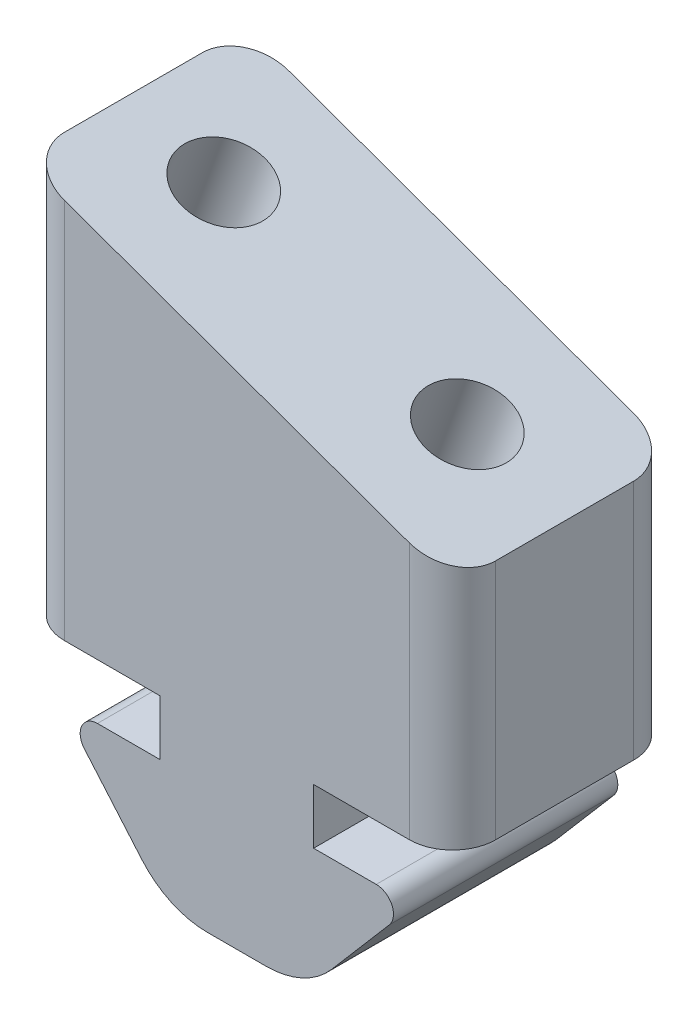
ISO-10303-21;
HEADER;
FILE_DESCRIPTION(('STEP AP214'),'2;1');
FILE_NAME('part.step','',(''),(''),'','','');
FILE_SCHEMA(('AUTOMOTIVE_DESIGN { 1 0 10303 214 1 1 1 1 }'));
ENDSEC;
DATA;
#1=APPLICATION_CONTEXT('core data for automotive mechanical design processes');
#2=APPLICATION_PROTOCOL_DEFINITION('international standard','automotive_design',2000,#1);
#3=PRODUCT_CONTEXT('',#1,'mechanical');
#4=PRODUCT('Part','Part','',(#3));
#5=PRODUCT_RELATED_PRODUCT_CATEGORY('part','',(#4));
#6=PRODUCT_DEFINITION_FORMATION('','',#4);
#7=PRODUCT_DEFINITION_CONTEXT('part definition',#1,'design');
#8=PRODUCT_DEFINITION('design','',#6,#7);
#9=PRODUCT_DEFINITION_SHAPE('','',#8);
#10=(LENGTH_UNIT() NAMED_UNIT(*) SI_UNIT(.MILLI.,.METRE.));
#11=(NAMED_UNIT(*) PLANE_ANGLE_UNIT() SI_UNIT($,.RADIAN.));
#12=(NAMED_UNIT(*) SI_UNIT($,.STERADIAN.) SOLID_ANGLE_UNIT());
#13=UNCERTAINTY_MEASURE_WITH_UNIT(LENGTH_MEASURE(1.E-05),#10,'distance_accuracy_value','');
#14=(GEOMETRIC_REPRESENTATION_CONTEXT(3) GLOBAL_UNCERTAINTY_ASSIGNED_CONTEXT((#13)) GLOBAL_UNIT_ASSIGNED_CONTEXT((#10,
#11,#12)) REPRESENTATION_CONTEXT('',''));
#15=CARTESIAN_POINT('',(0.,0.,0.));
#16=DIRECTION('',(0.,0.,1.));
#17=DIRECTION('',(1.,0.,0.));
#18=AXIS2_PLACEMENT_3D('',#15,#16,#17);
#19=CARTESIAN_POINT('',(12.5,0.,13.));
#20=DIRECTION('',(1.,0.,0.));
#21=DIRECTION('',(0.,1.,0.));
#22=AXIS2_PLACEMENT_3D('',#19,#20,#21);
#23=PLANE('',#22);
#24=DIRECTION('',(0.,0.,-1.));
#25=VECTOR('',#24,1.);
#26=CARTESIAN_POINT('',(12.5,10.5,13.));
#27=LINE('',#26,#25);
#28=CARTESIAN_POINT('',(12.5,10.5,10.5));
#29=VERTEX_POINT('',#28);
#30=CARTESIAN_POINT('',(12.5,10.5,2.5));
#31=VERTEX_POINT('',#30);
#32=EDGE_CURVE('E244',#29,#31,#27,.T.);
#33=ORIENTED_EDGE('',*,*,#32,.T.);
#34=DIRECTION('',(0.,-1.,0.));
#35=VECTOR('',#34,1.);
#36=CARTESIAN_POINT('',(12.5,24.5,2.5));
#37=LINE('',#36,#35);
#38=CARTESIAN_POINT('',(12.5,24.5,2.5));
#39=VERTEX_POINT('',#38);
#40=EDGE_CURVE('E325',#31,#39,#37,.F.);
#41=ORIENTED_EDGE('',*,*,#40,.T.);
#42=DIRECTION('',(0.,0.,-1.));
#43=VECTOR('',#42,1.);
#44=CARTESIAN_POINT('',(12.5,24.5,13.));
#45=LINE('',#44,#43);
#46=CARTESIAN_POINT('',(12.5,24.5,10.5));
#47=VERTEX_POINT('',#46);
#48=EDGE_CURVE('E257',#47,#39,#45,.T.);
#49=ORIENTED_EDGE('',*,*,#48,.F.);
#50=DIRECTION('',(0.,-1.,0.));
#51=VECTOR('',#50,1.);
#52=CARTESIAN_POINT('',(12.5,0.,10.5));
#53=LINE('',#52,#51);
#54=EDGE_CURVE('E322',#47,#29,#53,.T.);
#55=ORIENTED_EDGE('',*,*,#54,.T.);
#56=EDGE_LOOP('',(#33,#41,#49,#55));
#57=FACE_BOUND('',#56,.T.);
#58=ADVANCED_FACE('F41',(#57),#23,.T.);
#59=CARTESIAN_POINT('',(9.24220963172805,25.6728045325779,13.));
#60=DIRECTION('',(0.338719468272742,0.940887411868727,0.));
#61=DIRECTION('',(-0.940887411868727,0.338719468272742,0.));
#62=AXIS2_PLACEMENT_3D('',#59,#60,#61);
#63=PLANE('',#62);
#64=CARTESIAN_POINT('',(-7.25863564924326,31.6131088337276,6.5));
#65=DIRECTION('',(0.338719468272742,0.940887411868727,0.));
#66=DIRECTION('',(-0.940887411868727,0.338719468272742,0.));
#67=AXIS2_PLACEMENT_3D('',#64,#65,#66);
#68=CIRCLE('',#67,2.4);
#69=CARTESIAN_POINT('',(-9.51676543772821,32.4260355575822,6.5));
#70=VERTEX_POINT('',#69);
#71=EDGE_CURVE('E621',#70,#70,#68,.T.);
#72=ORIENTED_EDGE('',*,*,#71,.F.);
#73=EDGE_LOOP('',(#72));
#74=FACE_BOUND('',#73,.T.);
#75=CARTESIAN_POINT('',(6.85467552878764,26.5323168096365,6.5));
#76=DIRECTION('',(0.338719468272742,0.940887411868727,0.));
#77=DIRECTION('',(-0.940887411868727,0.338719468272742,0.));
#78=AXIS2_PLACEMENT_3D('',#75,#76,#77);
#79=CIRCLE('',#78,2.4);
#80=CARTESIAN_POINT('',(4.59654574030269,27.345243533491,6.5));
#81=VERTEX_POINT('',#80);
#82=EDGE_CURVE('E624',#81,#81,#79,.T.);
#83=ORIENTED_EDGE('',*,*,#82,.F.);
#84=EDGE_LOOP('',(#83));
#85=FACE_BOUND('',#84,.T.);
#86=DIRECTION('',(0.940887411868727,-0.338719468272742,0.));
#87=VECTOR('',#86,1.);
#88=CARTESIAN_POINT('',(9.24220963172805,25.6728045325779,0.));
#89=LINE('',#88,#87);
#90=CARTESIAN_POINT('',(-10.,32.6,0.));
#91=VERTEX_POINT('',#90);
#92=CARTESIAN_POINT('',(10.,25.4,0.));
#93=VERTEX_POINT('',#92);
#94=EDGE_CURVE('E221',#91,#93,#89,.T.);
#95=ORIENTED_EDGE('',*,*,#94,.F.);
#96=CARTESIAN_POINT('',(-10.,32.6,2.5));
#97=DIRECTION('',(0.338719468272742,0.940887411868727,0.));
#98=DIRECTION('',(0.940887411868727,-0.338719468272742,0.));
#99=AXIS2_PLACEMENT_3D('',#96,#97,#98);
#100=ELLIPSE('',#99,2.65706605111728,2.5);
#101=CARTESIAN_POINT('',(-12.5,33.5,2.5));
#102=VERTEX_POINT('',#101);
#103=EDGE_CURVE('E318',#91,#102,#100,.T.);
#104=ORIENTED_EDGE('',*,*,#103,.T.);
#105=DIRECTION('',(0.,0.,-1.));
#106=VECTOR('',#105,1.);
#107=CARTESIAN_POINT('',(-12.5,33.5,13.));
#108=LINE('',#107,#106);
#109=CARTESIAN_POINT('',(-12.5,33.5,10.5));
#110=VERTEX_POINT('',#109);
#111=EDGE_CURVE('E254',#110,#102,#108,.T.);
#112=ORIENTED_EDGE('',*,*,#111,.F.);
#113=CARTESIAN_POINT('',(-10.,32.6,10.5));
#114=DIRECTION('',(0.338719468272742,0.940887411868727,0.));
#115=DIRECTION('',(-0.940887411868727,0.338719468272742,0.));
#116=AXIS2_PLACEMENT_3D('',#113,#114,#115);
#117=ELLIPSE('',#116,2.65706605111728,2.5);
#118=CARTESIAN_POINT('',(-10.,32.6,13.));
#119=VERTEX_POINT('',#118);
#120=EDGE_CURVE('E314',#110,#119,#117,.T.);
#121=ORIENTED_EDGE('',*,*,#120,.T.);
#122=DIRECTION('',(0.940887411868727,-0.338719468272742,0.));
#123=VECTOR('',#122,1.);
#124=CARTESIAN_POINT('',(9.24220963172805,25.6728045325779,13.));
#125=LINE('',#124,#123);
#126=CARTESIAN_POINT('',(10.,25.4,13.));
#127=VERTEX_POINT('',#126);
#128=EDGE_CURVE('E187',#119,#127,#125,.T.);
#129=ORIENTED_EDGE('',*,*,#128,.T.);
#130=CARTESIAN_POINT('',(10.,25.4,10.5));
#131=DIRECTION('',(0.338719468272742,0.940887411868727,0.));
#132=DIRECTION('',(0.940887411868727,-0.338719468272742,0.));
#133=AXIS2_PLACEMENT_3D('',#130,#131,#132);
#134=ELLIPSE('',#133,2.65706605111728,2.5);
#135=EDGE_CURVE('E312',#127,#47,#134,.T.);
#136=ORIENTED_EDGE('',*,*,#135,.T.);
#137=ORIENTED_EDGE('',*,*,#48,.T.);
#138=CARTESIAN_POINT('',(10.,25.4,2.5));
#139=DIRECTION('',(0.338719468272742,0.940887411868727,0.));
#140=DIRECTION('',(-0.940887411868727,0.338719468272742,0.));
#141=AXIS2_PLACEMENT_3D('',#138,#139,#140);
#142=ELLIPSE('',#141,2.65706605111728,2.5);
#143=EDGE_CURVE('E316',#39,#93,#142,.T.);
#144=ORIENTED_EDGE('',*,*,#143,.T.);
#145=EDGE_LOOP('',(#95,#104,#112,#121,#129,#136,#137,#144));
#146=FACE_BOUND('',#145,.T.);
#147=ADVANCED_FACE('F332',(#74,#85,#146),#63,.T.);
#148=CARTESIAN_POINT('',(-12.5,0.,13.));
#149=DIRECTION('',(1.,0.,0.));
#150=DIRECTION('',(0.,0.,-1.));
#151=AXIS2_PLACEMENT_3D('',#148,#149,#150);
#152=PLANE('',#151);
#153=ORIENTED_EDGE('',*,*,#111,.T.);
#154=DIRECTION('',(0.,-1.,0.));
#155=VECTOR('',#154,1.);
#156=CARTESIAN_POINT('',(-12.5,0.,2.5));
#157=LINE('',#156,#155);
#158=CARTESIAN_POINT('',(-12.5,10.5,2.5));
#159=VERTEX_POINT('',#158);
#160=EDGE_CURVE('E300',#102,#159,#157,.T.);
#161=ORIENTED_EDGE('',*,*,#160,.T.);
#162=DIRECTION('',(0.,0.,-1.));
#163=VECTOR('',#162,1.);
#164=CARTESIAN_POINT('',(-12.5,10.5,13.));
#165=LINE('',#164,#163);
#166=CARTESIAN_POINT('',(-12.5,10.5,10.5));
#167=VERTEX_POINT('',#166);
#168=EDGE_CURVE('E198',#167,#159,#165,.T.);
#169=ORIENTED_EDGE('',*,*,#168,.F.);
#170=DIRECTION('',(0.,-1.,0.));
#171=VECTOR('',#170,1.);
#172=CARTESIAN_POINT('',(-12.5,33.5,10.5));
#173=LINE('',#172,#171);
#174=EDGE_CURVE('E298',#167,#110,#173,.F.);
#175=ORIENTED_EDGE('',*,*,#174,.T.);
#176=EDGE_LOOP('',(#153,#161,#169,#175));
#177=FACE_BOUND('',#176,.T.);
#178=ADVANCED_FACE('F355',(#177),#152,.F.);
#179=CARTESIAN_POINT('',(0.,10.5,13.));
#180=DIRECTION('',(0.,1.,0.));
#181=DIRECTION('',(-1.,0.,0.));
#182=AXIS2_PLACEMENT_3D('',#179,#180,#181);
#183=PLANE('',#182);
#184=ORIENTED_EDGE('',*,*,#168,.T.);
#185=CARTESIAN_POINT('',(-10.,10.5,2.5));
#186=DIRECTION('',(0.,1.,0.));
#187=DIRECTION('',(-1.,0.,0.));
#188=AXIS2_PLACEMENT_3D('',#185,#186,#187);
#189=CIRCLE('',#188,2.5);
#190=CARTESIAN_POINT('',(-10.,10.5,0.));
#191=VERTEX_POINT('',#190);
#192=EDGE_CURVE('E305',#159,#191,#189,.F.);
#193=ORIENTED_EDGE('',*,*,#192,.T.);
#194=DIRECTION('',(1.,0.,0.));
#195=VECTOR('',#194,1.);
#196=CARTESIAN_POINT('',(0.,10.5,0.));
#197=LINE('',#196,#195);
#198=CARTESIAN_POINT('',(-4.45,10.5,0.));
#199=VERTEX_POINT('',#198);
#200=EDGE_CURVE('E195',#191,#199,#197,.T.);
#201=ORIENTED_EDGE('',*,*,#200,.T.);
#202=DIRECTION('',(0.,0.,-1.));
#203=VECTOR('',#202,1.);
#204=CARTESIAN_POINT('',(-4.45,10.5,13.));
#205=LINE('',#204,#203);
#206=CARTESIAN_POINT('',(-4.45,10.5,13.));
#207=VERTEX_POINT('',#206);
#208=EDGE_CURVE('E191',#207,#199,#205,.T.);
#209=ORIENTED_EDGE('',*,*,#208,.F.);
#210=DIRECTION('',(1.,0.,0.));
#211=VECTOR('',#210,1.);
#212=CARTESIAN_POINT('',(0.,10.5,13.));
#213=LINE('',#212,#211);
#214=CARTESIAN_POINT('',(-10.,10.5,13.));
#215=VERTEX_POINT('',#214);
#216=EDGE_CURVE('E177',#215,#207,#213,.T.);
#217=ORIENTED_EDGE('',*,*,#216,.F.);
#218=CARTESIAN_POINT('',(-10.,10.5,10.5));
#219=DIRECTION('',(0.,1.,0.));
#220=DIRECTION('',(-1.,0.,0.));
#221=AXIS2_PLACEMENT_3D('',#218,#219,#220);
#222=CIRCLE('',#221,2.5);
#223=EDGE_CURVE('E303',#215,#167,#222,.F.);
#224=ORIENTED_EDGE('',*,*,#223,.T.);
#225=EDGE_LOOP('',(#184,#193,#201,#209,#217,#224));
#226=FACE_BOUND('',#225,.T.);
#227=ADVANCED_FACE('F193',(#226),#183,.F.);
#228=CARTESIAN_POINT('',(-4.45,0.,13.));
#229=DIRECTION('',(1.,0.,0.));
#230=DIRECTION('',(0.,1.,0.));
#231=AXIS2_PLACEMENT_3D('',#228,#229,#230);
#232=PLANE('',#231);
#233=DIRECTION('',(0.,-1.,0.));
#234=VECTOR('',#233,1.);
#235=CARTESIAN_POINT('',(-4.45,0.,0.));
#236=LINE('',#235,#234);
#237=CARTESIAN_POINT('',(-4.45,7.3,0.));
#238=VERTEX_POINT('',#237);
#239=EDGE_CURVE('E226',#199,#238,#236,.T.);
#240=ORIENTED_EDGE('',*,*,#239,.T.);
#241=DIRECTION('',(0.,0.,-1.));
#242=VECTOR('',#241,1.);
#243=CARTESIAN_POINT('',(-4.45,7.3,13.));
#244=LINE('',#243,#242);
#245=CARTESIAN_POINT('',(-4.45,7.3,13.));
#246=VERTEX_POINT('',#245);
#247=EDGE_CURVE('E199',#246,#238,#244,.T.);
#248=ORIENTED_EDGE('',*,*,#247,.F.);
#249=DIRECTION('',(0.,-1.,0.));
#250=VECTOR('',#249,1.);
#251=CARTESIAN_POINT('',(-4.45,0.,13.));
#252=LINE('',#251,#250);
#253=EDGE_CURVE('E183',#207,#246,#252,.T.);
#254=ORIENTED_EDGE('',*,*,#253,.F.);
#255=ORIENTED_EDGE('',*,*,#208,.T.);
#256=EDGE_LOOP('',(#240,#248,#254,#255));
#257=FACE_BOUND('',#256,.T.);
#258=ADVANCED_FACE('F201',(#257),#232,.F.);
#259=CARTESIAN_POINT('',(0.,7.3,13.));
#260=DIRECTION('',(0.,-1.,0.));
#261=DIRECTION('',(1.,0.,0.));
#262=AXIS2_PLACEMENT_3D('',#259,#260,#261);
#263=PLANE('',#262);
#264=DIRECTION('',(-1.,0.,0.));
#265=VECTOR('',#264,1.);
#266=CARTESIAN_POINT('',(0.,7.3,0.));
#267=LINE('',#266,#265);
#268=CARTESIAN_POINT('',(-8.07739440936548,7.3,0.));
#269=VERTEX_POINT('',#268);
#270=EDGE_CURVE('E229',#238,#269,#267,.T.);
#271=ORIENTED_EDGE('',*,*,#270,.T.);
#272=DIRECTION('',(0.,0.,-1.));
#273=VECTOR('',#272,1.);
#274=CARTESIAN_POINT('',(-8.07739440936548,7.3,13.));
#275=LINE('',#274,#273);
#276=CARTESIAN_POINT('',(-8.07739440936548,7.3,13.));
#277=VERTEX_POINT('',#276);
#278=EDGE_CURVE('E278',#269,#277,#275,.F.);
#279=ORIENTED_EDGE('',*,*,#278,.T.);
#280=DIRECTION('',(-1.,0.,0.));
#281=VECTOR('',#280,1.);
#282=CARTESIAN_POINT('',(0.,7.3,13.));
#283=LINE('',#282,#281);
#284=EDGE_CURVE('E204',#246,#277,#283,.T.);
#285=ORIENTED_EDGE('',*,*,#284,.F.);
#286=ORIENTED_EDGE('',*,*,#247,.T.);
#287=EDGE_LOOP('',(#271,#279,#285,#286));
#288=FACE_BOUND('',#287,.T.);
#289=ADVANCED_FACE('F406',(#288),#263,.F.);
#290=CARTESIAN_POINT('',(-2.30811293684524,-1.97612408976476,13.));
#291=DIRECTION('',(0.759623745160267,0.650362795513927,0.));
#292=DIRECTION('',(-0.650362795513927,0.759623745160267,0.));
#293=AXIS2_PLACEMENT_3D('',#290,#291,#292);
#294=PLANE('',#293);
#295=DIRECTION('',(0.650362795513927,-0.759623745160267,0.));
#296=VECTOR('',#295,1.);
#297=CARTESIAN_POINT('',(-2.30811293684524,-1.97612408976476,0.));
#298=LINE('',#297,#296);
#299=CARTESIAN_POINT('',(-8.83701815452575,5.64963720448607,0.));
#300=VERTEX_POINT('',#299);
#301=CARTESIAN_POINT('',(-5.49673460824518,1.74818602243036,0.));
#302=VERTEX_POINT('',#301);
#303=EDGE_CURVE('E232',#300,#302,#298,.T.);
#304=ORIENTED_EDGE('',*,*,#303,.T.);
#305=DIRECTION('',(0.,0.,-1.));
#306=VECTOR('',#305,1.);
#307=CARTESIAN_POINT('',(-5.49673460824518,1.74818602243036,13.));
#308=LINE('',#307,#306);
#309=CARTESIAN_POINT('',(-5.49673460824518,1.74818602243036,13.));
#310=VERTEX_POINT('',#309);
#311=EDGE_CURVE('E296',#302,#310,#308,.F.);
#312=ORIENTED_EDGE('',*,*,#311,.T.);
#313=DIRECTION('',(0.650362795513927,-0.759623745160267,0.));
#314=VECTOR('',#313,1.);
#315=CARTESIAN_POINT('',(-2.30811293684524,-1.97612408976476,13.));
#316=LINE('',#315,#314);
#317=CARTESIAN_POINT('',(-8.83701815452575,5.64963720448607,13.));
#318=VERTEX_POINT('',#317);
#319=EDGE_CURVE('E206',#318,#310,#316,.T.);
#320=ORIENTED_EDGE('',*,*,#319,.F.);
#321=DIRECTION('',(0.,0.,-1.));
#322=VECTOR('',#321,1.);
#323=CARTESIAN_POINT('',(-8.83701815452575,5.64963720448607,13.));
#324=LINE('',#323,#322);
#325=EDGE_CURVE('E275',#318,#300,#324,.T.);
#326=ORIENTED_EDGE('',*,*,#325,.T.);
#327=EDGE_LOOP('',(#304,#312,#320,#326));
#328=FACE_BOUND('',#327,.T.);
#329=ADVANCED_FACE('F413',(#328),#294,.F.);
#330=CARTESIAN_POINT('',(0.,0.,13.));
#331=DIRECTION('',(0.,1.,0.));
#332=DIRECTION('',(0.,0.,1.));
#333=AXIS2_PLACEMENT_3D('',#330,#331,#332);
#334=PLANE('',#333);
#335=DIRECTION('',(1.,0.,0.));
#336=VECTOR('',#335,1.);
#337=CARTESIAN_POINT('',(0.,0.,0.));
#338=LINE('',#337,#336);
#339=CARTESIAN_POINT('',(-1.69861588244384,0.,0.));
#340=VERTEX_POINT('',#339);
#341=CARTESIAN_POINT('',(1.69861588244384,0.,0.));
#342=VERTEX_POINT('',#341);
#343=EDGE_CURVE('E235',#340,#342,#338,.T.);
#344=ORIENTED_EDGE('',*,*,#343,.T.);
#345=DIRECTION('',(0.,0.,-1.));
#346=VECTOR('',#345,1.);
#347=CARTESIAN_POINT('',(1.69861588244384,0.,13.));
#348=LINE('',#347,#346);
#349=CARTESIAN_POINT('',(1.69861588244384,0.,13.));
#350=VERTEX_POINT('',#349);
#351=EDGE_CURVE('E290',#342,#350,#348,.F.);
#352=ORIENTED_EDGE('',*,*,#351,.T.);
#353=DIRECTION('',(1.,0.,0.));
#354=VECTOR('',#353,1.);
#355=CARTESIAN_POINT('',(0.,0.,13.));
#356=LINE('',#355,#354);
#357=CARTESIAN_POINT('',(-1.69861588244384,0.,13.));
#358=VERTEX_POINT('',#357);
#359=EDGE_CURVE('E212',#358,#350,#356,.T.);
#360=ORIENTED_EDGE('',*,*,#359,.F.);
#361=DIRECTION('',(0.,0.,-1.));
#362=VECTOR('',#361,1.);
#363=CARTESIAN_POINT('',(-1.69861588244384,0.,13.));
#364=LINE('',#363,#362);
#365=EDGE_CURVE('E287',#358,#340,#364,.T.);
#366=ORIENTED_EDGE('',*,*,#365,.T.);
#367=EDGE_LOOP('',(#344,#352,#360,#366));
#368=FACE_BOUND('',#367,.T.);
#369=ADVANCED_FACE('F420',(#368),#334,.F.);
#370=CARTESIAN_POINT('',(2.30811293684524,-1.97612408976476,13.));
#371=DIRECTION('',(-0.759623745160267,0.650362795513927,0.));
#372=DIRECTION('',(-0.650362795513927,-0.759623745160267,0.));
#373=AXIS2_PLACEMENT_3D('',#370,#371,#372);
#374=PLANE('',#373);
#375=DIRECTION('',(0.650362795513927,0.759623745160267,0.));
#376=VECTOR('',#375,1.);
#377=CARTESIAN_POINT('',(2.30811293684524,-1.97612408976476,13.));
#378=LINE('',#377,#376);
#379=CARTESIAN_POINT('',(5.49673460824518,1.74818602243037,13.));
#380=VERTEX_POINT('',#379);
#381=CARTESIAN_POINT('',(8.83701815452575,5.64963720448607,13.));
#382=VERTEX_POINT('',#381);
#383=EDGE_CURVE('E215',#380,#382,#378,.T.);
#384=ORIENTED_EDGE('',*,*,#383,.F.);
#385=DIRECTION('',(0.,0.,-1.));
#386=VECTOR('',#385,1.);
#387=CARTESIAN_POINT('',(5.49673460824518,1.74818602243036,13.));
#388=LINE('',#387,#386);
#389=CARTESIAN_POINT('',(5.49673460824518,1.74818602243037,0.));
#390=VERTEX_POINT('',#389);
#391=EDGE_CURVE('E280',#380,#390,#388,.T.);
#392=ORIENTED_EDGE('',*,*,#391,.T.);
#393=DIRECTION('',(0.650362795513927,0.759623745160267,0.));
#394=VECTOR('',#393,1.);
#395=CARTESIAN_POINT('',(2.30811293684524,-1.97612408976476,0.));
#396=LINE('',#395,#394);
#397=CARTESIAN_POINT('',(8.83701815452575,5.64963720448607,0.));
#398=VERTEX_POINT('',#397);
#399=EDGE_CURVE('E238',#390,#398,#396,.T.);
#400=ORIENTED_EDGE('',*,*,#399,.T.);
#401=DIRECTION('',(0.,0.,-1.));
#402=VECTOR('',#401,1.);
#403=CARTESIAN_POINT('',(8.83701815452575,5.64963720448607,13.));
#404=LINE('',#403,#402);
#405=EDGE_CURVE('E268',#398,#382,#404,.F.);
#406=ORIENTED_EDGE('',*,*,#405,.T.);
#407=EDGE_LOOP('',(#384,#392,#400,#406));
#408=FACE_BOUND('',#407,.T.);
#409=ADVANCED_FACE('F427',(#408),#374,.F.);
#410=CARTESIAN_POINT('',(0.,7.3,13.));
#411=DIRECTION('',(0.,-1.,0.));
#412=DIRECTION('',(1.,0.,0.));
#413=AXIS2_PLACEMENT_3D('',#410,#411,#412);
#414=PLANE('',#413);
#415=DIRECTION('',(-1.,0.,0.));
#416=VECTOR('',#415,1.);
#417=CARTESIAN_POINT('',(0.,7.3,13.));
#418=LINE('',#417,#416);
#419=CARTESIAN_POINT('',(8.07739440936548,7.3,13.));
#420=VERTEX_POINT('',#419);
#421=CARTESIAN_POINT('',(4.45,7.3,13.));
#422=VERTEX_POINT('',#421);
#423=EDGE_CURVE('E217',#420,#422,#418,.T.);
#424=ORIENTED_EDGE('',*,*,#423,.F.);
#425=DIRECTION('',(0.,0.,-1.));
#426=VECTOR('',#425,1.);
#427=CARTESIAN_POINT('',(8.07739440936548,7.3,13.));
#428=LINE('',#427,#426);
#429=CARTESIAN_POINT('',(8.07739440936548,7.3,0.));
#430=VERTEX_POINT('',#429);
#431=EDGE_CURVE('E260',#420,#430,#428,.T.);
#432=ORIENTED_EDGE('',*,*,#431,.T.);
#433=DIRECTION('',(-1.,0.,0.));
#434=VECTOR('',#433,1.);
#435=CARTESIAN_POINT('',(0.,7.3,0.));
#436=LINE('',#435,#434);
#437=CARTESIAN_POINT('',(4.45,7.3,0.));
#438=VERTEX_POINT('',#437);
#439=EDGE_CURVE('E240',#430,#438,#436,.T.);
#440=ORIENTED_EDGE('',*,*,#439,.T.);
#441=DIRECTION('',(0.,0.,-1.));
#442=VECTOR('',#441,1.);
#443=CARTESIAN_POINT('',(4.45,7.3,13.));
#444=LINE('',#443,#442);
#445=EDGE_CURVE('E249',#422,#438,#444,.T.);
#446=ORIENTED_EDGE('',*,*,#445,.F.);
#447=EDGE_LOOP('',(#424,#432,#440,#446));
#448=FACE_BOUND('',#447,.T.);
#449=ADVANCED_FACE('F351',(#448),#414,.F.);
#450=CARTESIAN_POINT('',(4.45,0.,13.));
#451=DIRECTION('',(-1.,0.,0.));
#452=DIRECTION('',(0.,-1.,0.));
#453=AXIS2_PLACEMENT_3D('',#450,#451,#452);
#454=PLANE('',#453);
#455=DIRECTION('',(0.,1.,0.));
#456=VECTOR('',#455,1.);
#457=CARTESIAN_POINT('',(4.45,0.,0.));
#458=LINE('',#457,#456);
#459=CARTESIAN_POINT('',(4.45,10.5,0.));
#460=VERTEX_POINT('',#459);
#461=EDGE_CURVE('E242',#438,#460,#458,.T.);
#462=ORIENTED_EDGE('',*,*,#461,.T.);
#463=DIRECTION('',(0.,0.,-1.));
#464=VECTOR('',#463,1.);
#465=CARTESIAN_POINT('',(4.45,10.5,13.));
#466=LINE('',#465,#464);
#467=CARTESIAN_POINT('',(4.45,10.5,13.));
#468=VERTEX_POINT('',#467);
#469=EDGE_CURVE('E246',#468,#460,#466,.T.);
#470=ORIENTED_EDGE('',*,*,#469,.F.);
#471=DIRECTION('',(0.,1.,0.));
#472=VECTOR('',#471,1.);
#473=CARTESIAN_POINT('',(4.45,0.,13.));
#474=LINE('',#473,#472);
#475=EDGE_CURVE('E219',#422,#468,#474,.T.);
#476=ORIENTED_EDGE('',*,*,#475,.F.);
#477=ORIENTED_EDGE('',*,*,#445,.T.);
#478=EDGE_LOOP('',(#462,#470,#476,#477));
#479=FACE_BOUND('',#478,.T.);
#480=ADVANCED_FACE('F342',(#479),#454,.F.);
#481=CARTESIAN_POINT('',(10.,10.5,0.));
#482=VERTEX_POINT('',#481);
#483=EDGE_CURVE('E227',#460,#482,#197,.T.);
#484=ORIENTED_EDGE('',*,*,#483,.T.);
#485=CARTESIAN_POINT('',(10.,10.5,2.5));
#486=DIRECTION('',(0.,1.,0.));
#487=DIRECTION('',(-1.,0.,0.));
#488=AXIS2_PLACEMENT_3D('',#485,#486,#487);
#489=CIRCLE('',#488,2.5);
#490=EDGE_CURVE('E62',#482,#31,#489,.F.);
#491=ORIENTED_EDGE('',*,*,#490,.T.);
#492=ORIENTED_EDGE('',*,*,#32,.F.);
#493=CARTESIAN_POINT('',(10.,10.5,10.5));
#494=DIRECTION('',(0.,1.,0.));
#495=DIRECTION('',(-1.,0.,0.));
#496=AXIS2_PLACEMENT_3D('',#493,#494,#495);
#497=CIRCLE('',#496,2.5);
#498=CARTESIAN_POINT('',(10.,10.5,13.));
#499=VERTEX_POINT('',#498);
#500=EDGE_CURVE('E56',#29,#499,#497,.F.);
#501=ORIENTED_EDGE('',*,*,#500,.T.);
#502=EDGE_CURVE('E189',#468,#499,#213,.T.);
#503=ORIENTED_EDGE('',*,*,#502,.F.);
#504=ORIENTED_EDGE('',*,*,#469,.T.);
#505=EDGE_LOOP('',(#484,#491,#492,#501,#503,#504));
#506=FACE_BOUND('',#505,.T.);
#507=ADVANCED_FACE('F339',(#506),#183,.F.);
#508=CARTESIAN_POINT('',(0.,0.,13.));
#509=DIRECTION('',(0.,0.,1.));
#510=DIRECTION('',(1.,0.,0.));
#511=AXIS2_PLACEMENT_3D('',#508,#509,#510);
#512=PLANE('',#511);
#513=ORIENTED_EDGE('',*,*,#128,.F.);
#514=DIRECTION('',(0.,-1.,0.));
#515=VECTOR('',#514,1.);
#516=CARTESIAN_POINT('',(-10.,10.5,13.));
#517=LINE('',#516,#515);
#518=EDGE_CURVE('E11',#119,#215,#517,.T.);
#519=ORIENTED_EDGE('',*,*,#518,.T.);
#520=ORIENTED_EDGE('',*,*,#216,.T.);
#521=ORIENTED_EDGE('',*,*,#253,.T.);
#522=ORIENTED_EDGE('',*,*,#284,.T.);
#523=CARTESIAN_POINT('',(-8.07739440936548,6.3,13.));
#524=DIRECTION('',(0.,0.,1.));
#525=DIRECTION('',(1.,0.,0.));
#526=AXIS2_PLACEMENT_3D('',#523,#524,#525);
#527=CIRCLE('',#526,1.);
#528=EDGE_CURVE('E271',#277,#318,#527,.T.);
#529=ORIENTED_EDGE('',*,*,#528,.T.);
#530=ORIENTED_EDGE('',*,*,#319,.T.);
#531=CARTESIAN_POINT('',(-1.69861588244384,5.,13.));
#532=DIRECTION('',(0.,0.,1.));
#533=DIRECTION('',(1.,0.,0.));
#534=AXIS2_PLACEMENT_3D('',#531,#532,#533);
#535=CIRCLE('',#534,5.);
#536=EDGE_CURVE('E292',#310,#358,#535,.T.);
#537=ORIENTED_EDGE('',*,*,#536,.T.);
#538=ORIENTED_EDGE('',*,*,#359,.T.);
#539=CARTESIAN_POINT('',(1.69861588244384,5.,13.));
#540=DIRECTION('',(0.,0.,1.));
#541=DIRECTION('',(1.,0.,0.));
#542=AXIS2_PLACEMENT_3D('',#539,#540,#541);
#543=CIRCLE('',#542,5.);
#544=EDGE_CURVE('E294',#350,#380,#543,.T.);
#545=ORIENTED_EDGE('',*,*,#544,.T.);
#546=ORIENTED_EDGE('',*,*,#383,.T.);
#547=CARTESIAN_POINT('',(8.07739440936548,6.3,13.));
#548=DIRECTION('',(0.,0.,1.));
#549=DIRECTION('',(1.,0.,0.));
#550=AXIS2_PLACEMENT_3D('',#547,#548,#549);
#551=CIRCLE('',#550,1.);
#552=EDGE_CURVE('E273',#382,#420,#551,.T.);
#553=ORIENTED_EDGE('',*,*,#552,.T.);
#554=ORIENTED_EDGE('',*,*,#423,.T.);
#555=ORIENTED_EDGE('',*,*,#475,.T.);
#556=ORIENTED_EDGE('',*,*,#502,.T.);
#557=DIRECTION('',(0.,-1.,0.));
#558=VECTOR('',#557,1.);
#559=CARTESIAN_POINT('',(10.,0.,13.));
#560=LINE('',#559,#558);
#561=EDGE_CURVE('E49',#499,#127,#560,.F.);
#562=ORIENTED_EDGE('',*,*,#561,.T.);
#563=EDGE_LOOP('',(#513,#519,#520,#521,#522,#529,#530,#537,#538,#545,#546,#553,#554,#555,#556,#562));
#564=FACE_BOUND('',#563,.T.);
#565=ADVANCED_FACE('F180',(#564),#512,.T.);
#566=CARTESIAN_POINT('',(0.,0.,0.));
#567=DIRECTION('',(0.,0.,1.));
#568=DIRECTION('',(1.,0.,0.));
#569=AXIS2_PLACEMENT_3D('',#566,#567,#568);
#570=PLANE('',#569);
#571=ORIENTED_EDGE('',*,*,#200,.F.);
#572=DIRECTION('',(0.,-1.,0.));
#573=VECTOR('',#572,1.);
#574=CARTESIAN_POINT('',(-10.,0.,0.));
#575=LINE('',#574,#573);
#576=EDGE_CURVE('E310',#191,#91,#575,.F.);
#577=ORIENTED_EDGE('',*,*,#576,.T.);
#578=ORIENTED_EDGE('',*,*,#94,.T.);
#579=DIRECTION('',(0.,-1.,0.));
#580=VECTOR('',#579,1.);
#581=CARTESIAN_POINT('',(10.,10.5,0.));
#582=LINE('',#581,#580);
#583=EDGE_CURVE('E307',#93,#482,#582,.T.);
#584=ORIENTED_EDGE('',*,*,#583,.T.);
#585=ORIENTED_EDGE('',*,*,#483,.F.);
#586=ORIENTED_EDGE('',*,*,#461,.F.);
#587=ORIENTED_EDGE('',*,*,#439,.F.);
#588=CARTESIAN_POINT('',(8.07739440936548,6.3,0.));
#589=DIRECTION('',(0.,0.,1.));
#590=DIRECTION('',(1.,0.,0.));
#591=AXIS2_PLACEMENT_3D('',#588,#589,#590);
#592=CIRCLE('',#591,1.);
#593=EDGE_CURVE('E265',#430,#398,#592,.F.);
#594=ORIENTED_EDGE('',*,*,#593,.T.);
#595=ORIENTED_EDGE('',*,*,#399,.F.);
#596=CARTESIAN_POINT('',(1.69861588244384,5.,0.));
#597=DIRECTION('',(0.,0.,1.));
#598=DIRECTION('',(1.,0.,0.));
#599=AXIS2_PLACEMENT_3D('',#596,#597,#598);
#600=CIRCLE('',#599,5.);
#601=EDGE_CURVE('E285',#390,#342,#600,.F.);
#602=ORIENTED_EDGE('',*,*,#601,.T.);
#603=ORIENTED_EDGE('',*,*,#343,.F.);
#604=CARTESIAN_POINT('',(-1.69861588244384,5.,0.));
#605=DIRECTION('',(0.,0.,1.));
#606=DIRECTION('',(1.,0.,0.));
#607=AXIS2_PLACEMENT_3D('',#604,#605,#606);
#608=CIRCLE('',#607,5.);
#609=EDGE_CURVE('E283',#340,#302,#608,.F.);
#610=ORIENTED_EDGE('',*,*,#609,.T.);
#611=ORIENTED_EDGE('',*,*,#303,.F.);
#612=CARTESIAN_POINT('',(-8.07739440936548,6.3,0.));
#613=DIRECTION('',(0.,0.,1.));
#614=DIRECTION('',(1.,0.,0.));
#615=AXIS2_PLACEMENT_3D('',#612,#613,#614);
#616=CIRCLE('',#615,1.);
#617=EDGE_CURVE('E263',#300,#269,#616,.F.);
#618=ORIENTED_EDGE('',*,*,#617,.T.);
#619=ORIENTED_EDGE('',*,*,#270,.F.);
#620=ORIENTED_EDGE('',*,*,#239,.F.);
#621=EDGE_LOOP('',(#571,#577,#578,#584,#585,#586,#587,#594,#595,#602,#603,#610,#611,#618,#619,#620));
#622=FACE_BOUND('',#621,.T.);
#623=ADVANCED_FACE('F348',(#622),#570,.F.);
#624=CARTESIAN_POINT('',(8.07739440936548,6.3,13.));
#625=DIRECTION('',(0.,0.,-1.));
#626=DIRECTION('',(-1.,0.,0.));
#627=AXIS2_PLACEMENT_3D('',#624,#625,#626);
#628=CYLINDRICAL_SURFACE('',#627,1.);
#629=ORIENTED_EDGE('',*,*,#552,.F.);
#630=ORIENTED_EDGE('',*,*,#405,.F.);
#631=ORIENTED_EDGE('',*,*,#593,.F.);
#632=ORIENTED_EDGE('',*,*,#431,.F.);
#633=EDGE_LOOP('',(#629,#630,#631,#632));
#634=FACE_BOUND('',#633,.T.);
#635=ADVANCED_FACE('F366',(#634),#628,.T.);
#636=CARTESIAN_POINT('',(-8.07739440936548,6.3,13.));
#637=DIRECTION('',(0.,0.,-1.));
#638=DIRECTION('',(-1.,0.,0.));
#639=AXIS2_PLACEMENT_3D('',#636,#637,#638);
#640=CYLINDRICAL_SURFACE('',#639,1.);
#641=ORIENTED_EDGE('',*,*,#528,.F.);
#642=ORIENTED_EDGE('',*,*,#278,.F.);
#643=ORIENTED_EDGE('',*,*,#617,.F.);
#644=ORIENTED_EDGE('',*,*,#325,.F.);
#645=EDGE_LOOP('',(#641,#642,#643,#644));
#646=FACE_BOUND('',#645,.T.);
#647=ADVANCED_FACE('F369',(#646),#640,.T.);
#648=CARTESIAN_POINT('',(1.69861588244384,5.,13.));
#649=DIRECTION('',(0.,0.,-1.));
#650=DIRECTION('',(-1.,0.,0.));
#651=AXIS2_PLACEMENT_3D('',#648,#649,#650);
#652=CYLINDRICAL_SURFACE('',#651,5.);
#653=ORIENTED_EDGE('',*,*,#544,.F.);
#654=ORIENTED_EDGE('',*,*,#351,.F.);
#655=ORIENTED_EDGE('',*,*,#601,.F.);
#656=ORIENTED_EDGE('',*,*,#391,.F.);
#657=EDGE_LOOP('',(#653,#654,#655,#656));
#658=FACE_BOUND('',#657,.T.);
#659=ADVANCED_FACE('F373',(#658),#652,.T.);
#660=CARTESIAN_POINT('',(-1.69861588244384,5.,13.));
#661=DIRECTION('',(0.,0.,-1.));
#662=DIRECTION('',(-1.,0.,0.));
#663=AXIS2_PLACEMENT_3D('',#660,#661,#662);
#664=CYLINDRICAL_SURFACE('',#663,5.);
#665=ORIENTED_EDGE('',*,*,#536,.F.);
#666=ORIENTED_EDGE('',*,*,#311,.F.);
#667=ORIENTED_EDGE('',*,*,#609,.F.);
#668=ORIENTED_EDGE('',*,*,#365,.F.);
#669=EDGE_LOOP('',(#665,#666,#667,#668));
#670=FACE_BOUND('',#669,.T.);
#671=ADVANCED_FACE('F377',(#670),#664,.T.);
#672=CARTESIAN_POINT('',(4.31427951674208,19.475661220621,6.5));
#673=DIRECTION('',(0.338719468272742,0.940887411868727,0.));
#674=DIRECTION('',(-0.940887411868727,0.338719468272742,0.));
#675=AXIS2_PLACEMENT_3D('',#672,#673,#674);
#676=CYLINDRICAL_SURFACE('',#675,2.4);
#677=CARTESIAN_POINT('',(4.31427951674208,19.475661220621,6.5));
#678=DIRECTION('',(0.338719468272742,0.940887411868727,0.));
#679=DIRECTION('',(-0.940887411868727,0.338719468272742,0.));
#680=AXIS2_PLACEMENT_3D('',#677,#678,#679);
#681=CIRCLE('',#680,2.4);
#682=CARTESIAN_POINT('',(2.05614972825713,20.2885879444756,6.5));
#683=VERTEX_POINT('',#682);
#684=EDGE_CURVE('E629',#683,#683,#681,.T.);
#685=CARTESIAN_POINT('',(2.05614972825713,20.2885879444756,6.5));
#686=CARTESIAN_POINT('',(2.08261218671594,20.3620947735278,6.5));
#687=CARTESIAN_POINT('',(2.10907464517475,20.4356016025801,6.5));
#688=CARTESIAN_POINT('',(2.16199956209236,20.5826152606846,6.5));
#689=CARTESIAN_POINT('',(2.18846202055117,20.6561220897368,6.5));
#690=CARTESIAN_POINT('',(2.24138693746879,20.8031357478413,6.5));
#691=CARTESIAN_POINT('',(2.2678493959276,20.8766425768935,6.5));
#692=CARTESIAN_POINT('',(2.32077431284521,21.023656234998,6.5));
#693=CARTESIAN_POINT('',(2.34723677130402,21.0971630640503,6.5));
#694=CARTESIAN_POINT('',(2.40016168822164,21.2441767221548,6.5));
#695=CARTESIAN_POINT('',(2.42662414668044,21.317683551207,6.5));
#696=CARTESIAN_POINT('',(2.47954906359806,21.4646972093115,6.5));
#697=CARTESIAN_POINT('',(2.50601152205687,21.5382040383637,6.5));
#698=CARTESIAN_POINT('',(2.55893643897448,21.6852176964682,6.5));
#699=CARTESIAN_POINT('',(2.58539889743329,21.7587245255205,6.5));
#700=CARTESIAN_POINT('',(2.63832381435091,21.905738183625,6.5));
#701=CARTESIAN_POINT('',(2.66478627280972,21.9792450126772,6.5));
#702=CARTESIAN_POINT('',(2.71771118972733,22.1262586707817,6.5));
#703=CARTESIAN_POINT('',(2.74417364818614,22.1997654998339,6.5));
#704=CARTESIAN_POINT('',(2.79709856510375,22.3467791579384,6.5));
#705=CARTESIAN_POINT('',(2.82356102356256,22.4202859869907,6.5));
#706=CARTESIAN_POINT('',(2.87648594048018,22.5672996450952,6.5));
#707=CARTESIAN_POINT('',(2.90294839893899,22.6408064741474,6.5));
#708=CARTESIAN_POINT('',(2.9558733158566,22.7878201322519,6.5));
#709=CARTESIAN_POINT('',(2.98233577431541,22.8613269613041,6.5));
#710=CARTESIAN_POINT('',(3.03526069123303,23.0083406194086,6.5));
#711=CARTESIAN_POINT('',(3.06172314969183,23.0818474484609,6.5));
#712=CARTESIAN_POINT('',(3.11464806660945,23.2288611065654,6.5));
#713=CARTESIAN_POINT('',(3.14111052506826,23.3023679356176,6.5));
#714=CARTESIAN_POINT('',(3.19403544198587,23.4493815937221,6.5));
#715=CARTESIAN_POINT('',(3.22049790044468,23.5228884227743,6.5));
#716=CARTESIAN_POINT('',(3.2734228173623,23.6699020808788,6.5));
#717=CARTESIAN_POINT('',(3.29988527582111,23.7434089099311,6.5));
#718=CARTESIAN_POINT('',(3.35281019273872,23.8904225680356,6.5));
#719=CARTESIAN_POINT('',(3.37927265119753,23.9639293970878,6.5));
#720=CARTESIAN_POINT('',(3.43219756811515,24.1109430551923,6.5));
#721=CARTESIAN_POINT('',(3.45866002657395,24.1844498842445,6.5));
#722=CARTESIAN_POINT('',(3.51158494349157,24.331463542349,6.5));
#723=CARTESIAN_POINT('',(3.53804740195038,24.4049703714013,6.5));
#724=CARTESIAN_POINT('',(3.59097231886799,24.5519840295058,6.5));
#725=CARTESIAN_POINT('',(3.6174347773268,24.625490858558,6.5));
#726=CARTESIAN_POINT('',(3.67035969424442,24.7725045166625,6.5));
#727=CARTESIAN_POINT('',(3.69682215270322,24.8460113457147,6.5));
#728=CARTESIAN_POINT('',(3.74974706962084,24.9930250038192,6.5));
#729=CARTESIAN_POINT('',(3.77620952807965,25.0665318328715,6.5));
#730=CARTESIAN_POINT('',(3.82913444499726,25.213545490976,6.5));
#731=CARTESIAN_POINT('',(3.85559690345607,25.2870523200282,6.5));
#732=CARTESIAN_POINT('',(3.90852182037369,25.4340659781327,6.5));
#733=CARTESIAN_POINT('',(3.9349842788325,25.5075728071849,6.5));
#734=CARTESIAN_POINT('',(3.98790919575011,25.6545864652894,6.5));
#735=CARTESIAN_POINT('',(4.01437165420892,25.7280932943417,6.5));
#736=CARTESIAN_POINT('',(4.06729657112654,25.8751069524462,6.5));
#737=CARTESIAN_POINT('',(4.09375902958534,25.9486137814984,6.5));
#738=CARTESIAN_POINT('',(4.14668394650296,26.0956274396029,6.5));
#739=CARTESIAN_POINT('',(4.17314640496177,26.1691342686551,6.5));
#740=CARTESIAN_POINT('',(4.22607132187938,26.3161479267596,6.5));
#741=CARTESIAN_POINT('',(4.25253378033819,26.3896547558119,6.5));
#742=CARTESIAN_POINT('',(4.30545869725581,26.5366684139164,6.5));
#743=CARTESIAN_POINT('',(4.33192115571462,26.6101752429686,6.5));
#744=CARTESIAN_POINT('',(4.38484607263223,26.7571889010731,6.5));
#745=CARTESIAN_POINT('',(4.41130853109104,26.8306957301253,6.5));
#746=CARTESIAN_POINT('',(4.46423344800866,26.9777093882298,6.5));
#747=CARTESIAN_POINT('',(4.49069590646746,27.0512162172821,6.5));
#748=CARTESIAN_POINT('',(4.54362082338508,27.1982298753866,6.5));
#749=CARTESIAN_POINT('',(4.57008328184389,27.2717367044388,6.5));
#750=CARTESIAN_POINT('',(4.59654574030269,27.345243533491,6.5));
#751=B_SPLINE_CURVE_WITH_KNOTS('',3,(#685,#686,#687,#688,#689,#690,#691,#692,#693,#694,#695,
#696,#697,#698,#699,#700,#701,#702,#703,#704,#705,#706,#707,#708,#709,#710,#711,#712,#713,#714,
#715,#716,#717,#718,#719,#720,#721,#722,#723,#724,#725,#726,#727,#728,#729,#730,#731,#732,#733,
#734,#735,#736,#737,#738,#739,#740,#741,#742,#743,#744,#745,#746,#747,#748,#749,#750),
.UNSPECIFIED.,.F.,.F.,(4,2,2,2,2,2,2,2,2,2,2,2,2,2,2,2,2,2,2,2,2,2,2,2,2,2,2,2,2,2,2,2,4),(0.,
0.234375000000001,0.468750000000001,0.703125000000002,0.937500000000002,1.171875,1.40625,
1.640625,1.875,2.109375,2.34375,2.578125,2.8125,3.046875,3.28125,3.515625,3.75,3.984375,4.21875,
4.453125,4.6875,4.921875,5.15625,5.390625,5.625,5.859375,6.09375,6.328125,6.5625,6.796875,
7.03125,7.265625,7.5),.UNSPECIFIED.);
#752=EDGE_CURVE('BSEAM381',#683,#81,#751,.T.);
#753=ORIENTED_EDGE('',*,*,#684,.F.);
#754=ORIENTED_EDGE('',*,*,#82,.T.);
#755=ORIENTED_EDGE('',*,*,#752,.T.);
#756=ORIENTED_EDGE('',*,*,#752,.F.);
#757=EDGE_LOOP('',(#753,#755,#754,#756));
#758=FACE_BOUND('',#757,.T.);
#759=ADVANCED_FACE('F381',(#758),#676,.F.);
#760=CARTESIAN_POINT('',(4.31427951674208,19.475661220621,6.5));
#761=DIRECTION('',(0.338719468272742,0.940887411868727,0.));
#762=DIRECTION('',(-0.940887411868727,0.338719468272742,0.));
#763=AXIS2_PLACEMENT_3D('',#760,#761,#762);
#764=PLANE('',#763);
#765=ORIENTED_EDGE('',*,*,#684,.T.);
#766=EDGE_LOOP('',(#765));
#767=FACE_BOUND('',#766,.T.);
#768=ADVANCED_FACE('F566',(#767),#764,.T.);
#769=CARTESIAN_POINT('',(-9.79903166128882,24.5564532447121,6.5));
#770=DIRECTION('',(0.338719468272742,0.940887411868727,0.));
#771=DIRECTION('',(-0.940887411868727,0.338719468272742,0.));
#772=AXIS2_PLACEMENT_3D('',#769,#770,#771);
#773=CYLINDRICAL_SURFACE('',#772,2.4);
#774=CARTESIAN_POINT('',(-9.79903166128882,24.5564532447121,6.5));
#775=DIRECTION('',(0.338719468272742,0.940887411868727,0.));
#776=DIRECTION('',(-0.940887411868727,0.338719468272742,0.));
#777=AXIS2_PLACEMENT_3D('',#774,#775,#776);
#778=CIRCLE('',#777,2.4);
#779=CARTESIAN_POINT('',(-12.0571614497738,25.3693799685667,6.5));
#780=VERTEX_POINT('',#779);
#781=EDGE_CURVE('E224',#780,#780,#778,.T.);
#782=CARTESIAN_POINT('',(-12.0571614497738,25.3693799685667,6.5));
#783=CARTESIAN_POINT('',(-12.030698991315,25.442886797619,6.5));
#784=CARTESIAN_POINT('',(-12.0042365328561,25.5163936266712,6.5));
#785=CARTESIAN_POINT('',(-11.9513116159385,25.6634072847757,6.5));
#786=CARTESIAN_POINT('',(-11.9248491574797,25.7369141138279,6.5));
#787=CARTESIAN_POINT('',(-11.8719242405621,25.8839277719324,6.5));
#788=CARTESIAN_POINT('',(-11.8454617821033,25.9574346009847,6.5));
#789=CARTESIAN_POINT('',(-11.7925368651857,26.1044482590892,6.5));
#790=CARTESIAN_POINT('',(-11.7660744067269,26.1779550881414,6.5));
#791=CARTESIAN_POINT('',(-11.7131494898093,26.3249687462459,6.5));
#792=CARTESIAN_POINT('',(-11.6866870313505,26.3984755752981,6.5));
#793=CARTESIAN_POINT('',(-11.6337621144328,26.5454892334026,6.5));
#794=CARTESIAN_POINT('',(-11.607299655974,26.6189960624549,6.5));
#795=CARTESIAN_POINT('',(-11.5543747390564,26.7660097205594,6.5));
#796=CARTESIAN_POINT('',(-11.5279122805976,26.8395165496116,6.5));
#797=CARTESIAN_POINT('',(-11.47498736368,26.9865302077161,6.5));
#798=CARTESIAN_POINT('',(-11.4485249052212,27.0600370367683,6.5));
#799=CARTESIAN_POINT('',(-11.3955999883036,27.2070506948728,6.5));
#800=CARTESIAN_POINT('',(-11.3691375298448,27.2805575239251,6.5));
#801=CARTESIAN_POINT('',(-11.3162126129271,27.4275711820296,6.5));
#802=CARTESIAN_POINT('',(-11.2897501544683,27.5010780110818,6.5));
#803=CARTESIAN_POINT('',(-11.2368252375507,27.6480916691863,6.5));
#804=CARTESIAN_POINT('',(-11.2103627790919,27.7215984982385,6.5));
#805=CARTESIAN_POINT('',(-11.1574378621743,27.868612156343,6.5));
#806=CARTESIAN_POINT('',(-11.1309754037155,27.9421189853953,6.5));
#807=CARTESIAN_POINT('',(-11.0780504867979,28.0891326434998,6.5));
#808=CARTESIAN_POINT('',(-11.0515880283391,28.162639472552,6.5));
#809=CARTESIAN_POINT('',(-10.9986631114215,28.3096531306565,6.5));
#810=CARTESIAN_POINT('',(-10.9722006529626,28.3831599597087,6.5));
#811=CARTESIAN_POINT('',(-10.919275736045,28.5301736178132,6.5));
#812=CARTESIAN_POINT('',(-10.8928132775862,28.6036804468655,6.5));
#813=CARTESIAN_POINT('',(-10.8398883606686,28.75069410497,6.5));
#814=CARTESIAN_POINT('',(-10.8134259022098,28.8242009340222,6.5));
#815=CARTESIAN_POINT('',(-10.7605009852922,28.9712145921267,6.5));
#816=CARTESIAN_POINT('',(-10.7340385268334,29.0447214211789,6.5));
#817=CARTESIAN_POINT('',(-10.6811136099158,29.1917350792834,6.5));
#818=CARTESIAN_POINT('',(-10.6546511514569,29.2652419083357,6.5));
#819=CARTESIAN_POINT('',(-10.6017262345393,29.4122555664402,6.5));
#820=CARTESIAN_POINT('',(-10.5752637760805,29.4857623954924,6.5));
#821=CARTESIAN_POINT('',(-10.5223388591629,29.6327760535969,6.5));
#822=CARTESIAN_POINT('',(-10.4958764007041,29.7062828826491,6.5));
#823=CARTESIAN_POINT('',(-10.4429514837865,29.8532965407536,6.5));
#824=CARTESIAN_POINT('',(-10.4164890253277,29.9268033698059,6.5));
#825=CARTESIAN_POINT('',(-10.3635641084101,30.0738170279104,6.5));
#826=CARTESIAN_POINT('',(-10.3371016499513,30.1473238569626,6.5));
#827=CARTESIAN_POINT('',(-10.2841767330336,30.2943375150671,6.5));
#828=CARTESIAN_POINT('',(-10.2577142745748,30.3678443441193,6.5));
#829=CARTESIAN_POINT('',(-10.2047893576572,30.5148580022238,6.5));
#830=CARTESIAN_POINT('',(-10.1783268991984,30.5883648312761,6.5));
#831=CARTESIAN_POINT('',(-10.1254019822808,30.7353784893806,6.5));
#832=CARTESIAN_POINT('',(-10.098939523822,30.8088853184328,6.5));
#833=CARTESIAN_POINT('',(-10.0460146069044,30.9558989765373,6.5));
#834=CARTESIAN_POINT('',(-10.0195521484456,31.0294058055895,6.5));
#835=CARTESIAN_POINT('',(-9.96662723152794,31.176419463694,6.5));
#836=CARTESIAN_POINT('',(-9.94016477306913,31.2499262927463,6.5));
#837=CARTESIAN_POINT('',(-9.88723985615152,31.3969399508508,6.5));
#838=CARTESIAN_POINT('',(-9.86077739769271,31.470446779903,6.5));
#839=CARTESIAN_POINT('',(-9.80785248077509,31.6174604380075,6.5));
#840=CARTESIAN_POINT('',(-9.78139002231628,31.6909672670597,6.5));
#841=CARTESIAN_POINT('',(-9.72846510539867,31.8379809251642,6.5));
#842=CARTESIAN_POINT('',(-9.70200264693986,31.9114877542165,6.5));
#843=CARTESIAN_POINT('',(-9.64907773002225,32.058501412321,6.5));
#844=CARTESIAN_POINT('',(-9.62261527156344,32.1320082413732,6.5));
#845=CARTESIAN_POINT('',(-9.56969035464582,32.2790218994777,6.5));
#846=CARTESIAN_POINT('',(-9.54322789618701,32.3525287285299,6.5));
#847=CARTESIAN_POINT('',(-9.51676543772821,32.4260355575822,6.5));
#848=B_SPLINE_CURVE_WITH_KNOTS('',3,(#782,#783,#784,#785,#786,#787,#788,#789,#790,#791,#792,
#793,#794,#795,#796,#797,#798,#799,#800,#801,#802,#803,#804,#805,#806,#807,#808,#809,#810,#811,
#812,#813,#814,#815,#816,#817,#818,#819,#820,#821,#822,#823,#824,#825,#826,#827,#828,#829,#830,
#831,#832,#833,#834,#835,#836,#837,#838,#839,#840,#841,#842,#843,#844,#845,#846,#847),
.UNSPECIFIED.,.F.,.F.,(4,2,2,2,2,2,2,2,2,2,2,2,2,2,2,2,2,2,2,2,2,2,2,2,2,2,2,2,2,2,2,2,4),(0.,
0.234375000000001,0.468750000000001,0.703125000000002,0.937500000000003,1.171875,1.40625,
1.640625,1.875,2.109375,2.34375,2.578125,2.8125,3.046875,3.28125,3.515625,3.75,3.984375,4.21875,
4.453125,4.6875,4.921875,5.15625,5.390625,5.625,5.859375,6.09375,6.328125,6.5625,6.796875,
7.03125,7.265625,7.5),.UNSPECIFIED.);
#849=EDGE_CURVE('BSEAM576',#780,#70,#848,.T.);
#850=ORIENTED_EDGE('',*,*,#781,.F.);
#851=ORIENTED_EDGE('',*,*,#71,.T.);
#852=ORIENTED_EDGE('',*,*,#849,.T.);
#853=ORIENTED_EDGE('',*,*,#849,.F.);
#854=EDGE_LOOP('',(#850,#852,#851,#853));
#855=FACE_BOUND('',#854,.T.);
#856=ADVANCED_FACE('F576',(#855),#773,.F.);
#857=CARTESIAN_POINT('',(-9.79903166128882,24.5564532447121,6.5));
#858=DIRECTION('',(0.338719468272742,0.940887411868727,0.));
#859=DIRECTION('',(-0.940887411868727,0.338719468272742,0.));
#860=AXIS2_PLACEMENT_3D('',#857,#858,#859);
#861=PLANE('',#860);
#862=ORIENTED_EDGE('',*,*,#781,.T.);
#863=EDGE_LOOP('',(#862));
#864=FACE_BOUND('',#863,.T.);
#865=ADVANCED_FACE('F387',(#864),#861,.T.);
#866=CARTESIAN_POINT('',(-10.,0.,2.5));
#867=DIRECTION('',(0.,-1.,0.));
#868=DIRECTION('',(0.,0.,-1.));
#869=AXIS2_PLACEMENT_3D('',#866,#867,#868);
#870=CYLINDRICAL_SURFACE('',#869,2.5);
#871=ORIENTED_EDGE('',*,*,#103,.F.);
#872=ORIENTED_EDGE('',*,*,#576,.F.);
#873=ORIENTED_EDGE('',*,*,#192,.F.);
#874=ORIENTED_EDGE('',*,*,#160,.F.);
#875=EDGE_LOOP('',(#871,#872,#873,#874));
#876=FACE_BOUND('',#875,.T.);
#877=ADVANCED_FACE('F383',(#876),#870,.T.);
#878=CARTESIAN_POINT('',(10.,0.,2.5));
#879=DIRECTION('',(0.,1.,0.));
#880=DIRECTION('',(-1.,0.,0.));
#881=AXIS2_PLACEMENT_3D('',#878,#879,#880);
#882=CYLINDRICAL_SURFACE('',#881,2.5);
#883=ORIENTED_EDGE('',*,*,#143,.F.);
#884=ORIENTED_EDGE('',*,*,#40,.F.);
#885=ORIENTED_EDGE('',*,*,#490,.F.);
#886=ORIENTED_EDGE('',*,*,#583,.F.);
#887=EDGE_LOOP('',(#883,#884,#885,#886));
#888=FACE_BOUND('',#887,.T.);
#889=ADVANCED_FACE('F386',(#888),#882,.T.);
#890=CARTESIAN_POINT('',(-10.,0.,10.5));
#891=DIRECTION('',(0.,1.,0.));
#892=DIRECTION('',(0.,0.,1.));
#893=AXIS2_PLACEMENT_3D('',#890,#891,#892);
#894=CYLINDRICAL_SURFACE('',#893,2.5);
#895=ORIENTED_EDGE('',*,*,#120,.F.);
#896=ORIENTED_EDGE('',*,*,#174,.F.);
#897=ORIENTED_EDGE('',*,*,#223,.F.);
#898=ORIENTED_EDGE('',*,*,#518,.F.);
#899=EDGE_LOOP('',(#895,#896,#897,#898));
#900=FACE_BOUND('',#899,.T.);
#901=ADVANCED_FACE('F390',(#900),#894,.T.);
#902=CARTESIAN_POINT('',(10.,0.,10.5));
#903=DIRECTION('',(0.,-1.,0.));
#904=DIRECTION('',(1.,0.,0.));
#905=AXIS2_PLACEMENT_3D('',#902,#903,#904);
#906=CYLINDRICAL_SURFACE('',#905,2.5);
#907=ORIENTED_EDGE('',*,*,#135,.F.);
#908=ORIENTED_EDGE('',*,*,#561,.F.);
#909=ORIENTED_EDGE('',*,*,#500,.F.);
#910=ORIENTED_EDGE('',*,*,#54,.F.);
#911=EDGE_LOOP('',(#907,#908,#909,#910));
#912=FACE_BOUND('',#911,.T.);
#913=ADVANCED_FACE('F43',(#912),#906,.T.);
#914=CLOSED_SHELL('',(#58,#147,#178,#227,#258,#289,#329,#369,#409,#449,#480,#507,#565,#623,#635,
#647,#659,#671,#759,#768,#856,#865,#877,#889,#901,#913));
#915=MANIFOLD_SOLID_BREP('B2',#914);
#916=ADVANCED_BREP_SHAPE_REPRESENTATION('',(#18,#915),#14);
#917=SHAPE_DEFINITION_REPRESENTATION(#9,#916);
ENDSEC;
END-ISO-10303-21;
